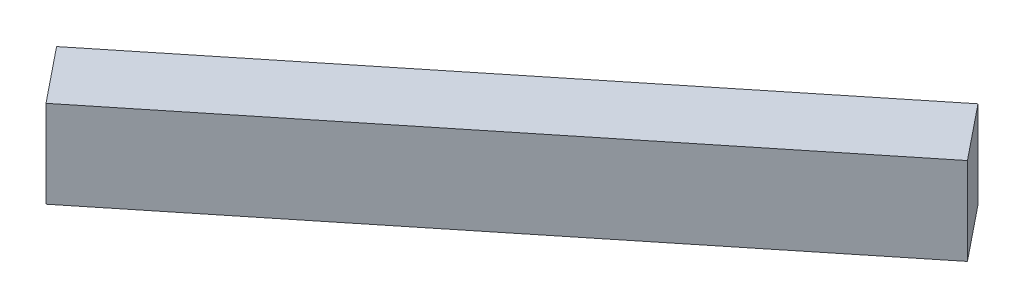
ISO-10303-21;
HEADER;
FILE_DESCRIPTION(('STEP AP214'),'2;1');
FILE_NAME('part.step','',(''),(''),'','','');
FILE_SCHEMA(('AUTOMOTIVE_DESIGN { 1 0 10303 214 1 1 1 1 }'));
ENDSEC;
DATA;
#1=APPLICATION_CONTEXT('core data for automotive mechanical design processes');
#2=APPLICATION_PROTOCOL_DEFINITION('international standard','automotive_design',2000,#1);
#3=PRODUCT_CONTEXT('',#1,'mechanical');
#4=PRODUCT('Part','Part','',(#3));
#5=PRODUCT_RELATED_PRODUCT_CATEGORY('part','',(#4));
#6=PRODUCT_DEFINITION_FORMATION('','',#4);
#7=PRODUCT_DEFINITION_CONTEXT('part definition',#1,'design');
#8=PRODUCT_DEFINITION('design','',#6,#7);
#9=PRODUCT_DEFINITION_SHAPE('','',#8);
#10=(LENGTH_UNIT() NAMED_UNIT(*) SI_UNIT(.MILLI.,.METRE.));
#11=(NAMED_UNIT(*) PLANE_ANGLE_UNIT() SI_UNIT($,.RADIAN.));
#12=(NAMED_UNIT(*) SI_UNIT($,.STERADIAN.) SOLID_ANGLE_UNIT());
#13=UNCERTAINTY_MEASURE_WITH_UNIT(LENGTH_MEASURE(1.E-05),#10,'distance_accuracy_value','');
#14=(GEOMETRIC_REPRESENTATION_CONTEXT(3) GLOBAL_UNCERTAINTY_ASSIGNED_CONTEXT((#13)) GLOBAL_UNIT_ASSIGNED_CONTEXT((#10,
#11,#12)) REPRESENTATION_CONTEXT('',''));
#15=CARTESIAN_POINT('',(0.,0.,0.));
#16=DIRECTION('',(0.,0.,1.));
#17=DIRECTION('',(1.,0.,0.));
#18=AXIS2_PLACEMENT_3D('',#15,#16,#17);
#19=CARTESIAN_POINT('',(13.9519511098659,7.874,-11.3695960101614));
#20=DIRECTION('',(0.627392406961112,0.,0.778703260355023));
#21=DIRECTION('',(0.778703260355023,0.,-0.627392406961112));
#22=AXIS2_PLACEMENT_3D('',#19,#20,#21);
#23=PLANE('',#22);
#24=DIRECTION('',(0.,1.,0.));
#25=VECTOR('',#24,1.);
#26=CARTESIAN_POINT('',(13.9519511098659,7.874,-11.3695960101614));
#27=LINE('',#26,#25);
#28=CARTESIAN_POINT('',(13.9519511098659,7.62,-11.3695960101614));
#29=VERTEX_POINT('',#28);
#30=CARTESIAN_POINT('',(13.9519511098659,7.874,-11.3695960101614));
#31=VERTEX_POINT('',#30);
#32=EDGE_CURVE('E20',#29,#31,#27,.T.);
#33=ORIENTED_EDGE('',*,*,#32,.T.);
#34=DIRECTION('',(0.778703260355018,0.,-0.627392406961118));
#35=VECTOR('',#34,1.);
#36=CARTESIAN_POINT('',(13.9519511098659,7.874,-11.3695960101614));
#37=LINE('',#36,#35);
#38=CARTESIAN_POINT('',(15.4353808208423,7.874,-12.5647785454224));
#39=VERTEX_POINT('',#38);
#40=EDGE_CURVE('E55',#31,#39,#37,.T.);
#41=ORIENTED_EDGE('',*,*,#40,.T.);
#42=DIRECTION('',(0.,1.,0.));
#43=VECTOR('',#42,1.);
#44=CARTESIAN_POINT('',(15.4353808208423,7.874,-12.5647785454224));
#45=LINE('',#44,#43);
#46=CARTESIAN_POINT('',(15.4353808208423,7.62,-12.5647785454224));
#47=VERTEX_POINT('',#46);
#48=EDGE_CURVE('E76',#39,#47,#45,.F.);
#49=ORIENTED_EDGE('',*,*,#48,.T.);
#50=DIRECTION('',(0.778703260355018,0.,-0.627392406961118));
#51=VECTOR('',#50,1.);
#52=CARTESIAN_POINT('',(13.9519511098659,7.62,-11.3695960101614));
#53=LINE('',#52,#51);
#54=EDGE_CURVE('E58',#29,#47,#53,.T.);
#55=ORIENTED_EDGE('',*,*,#54,.F.);
#56=EDGE_LOOP('',(#33,#41,#49,#55));
#57=FACE_BOUND('',#56,.T.);
#58=ADVANCED_FACE('F17',(#57),#23,.F.);
#59=CARTESIAN_POINT('',(13.9519511098659,7.874,-11.3695960101614));
#60=DIRECTION('',(0.778703260355001,0.,-0.627392406961139));
#61=DIRECTION('',(-0.627392406961139,0.,-0.778703260355001));
#62=AXIS2_PLACEMENT_3D('',#59,#60,#61);
#63=PLANE('',#62);
#64=DIRECTION('',(0.,1.,0.));
#65=VECTOR('',#64,1.);
#66=CARTESIAN_POINT('',(14.0794372469605,7.874,-11.2113635076573));
#67=LINE('',#66,#65);
#68=CARTESIAN_POINT('',(14.0794372469605,7.62,-11.2113635076573));
#69=VERTEX_POINT('',#68);
#70=CARTESIAN_POINT('',(14.0794372469605,7.874,-11.2113635076573));
#71=VERTEX_POINT('',#70);
#72=EDGE_CURVE('E73',#69,#71,#67,.T.);
#73=ORIENTED_EDGE('',*,*,#72,.T.);
#74=DIRECTION('',(-0.627392406961511,0.,-0.778703260354701));
#75=VECTOR('',#74,1.);
#76=CARTESIAN_POINT('',(14.0794372469605,7.874,-11.2113635076573));
#77=LINE('',#76,#75);
#78=EDGE_CURVE('E63',#71,#31,#77,.T.);
#79=ORIENTED_EDGE('',*,*,#78,.T.);
#80=ORIENTED_EDGE('',*,*,#32,.F.);
#81=DIRECTION('',(-0.627392406961511,0.,-0.778703260354701));
#82=VECTOR('',#81,1.);
#83=CARTESIAN_POINT('',(14.0794372469605,7.62,-11.2113635076573));
#84=LINE('',#83,#82);
#85=EDGE_CURVE('E80',#69,#29,#84,.T.);
#86=ORIENTED_EDGE('',*,*,#85,.F.);
#87=EDGE_LOOP('',(#73,#79,#80,#86));
#88=FACE_BOUND('',#87,.T.);
#89=ADVANCED_FACE('F72',(#88),#63,.F.);
#90=CARTESIAN_POINT('',(13.9519511098659,7.874,-11.3695960101614));
#91=DIRECTION('',(0.,-1.,0.));
#92=DIRECTION('',(0.,0.,-1.));
#93=AXIS2_PLACEMENT_3D('',#90,#91,#92);
#94=PLANE('',#93);
#95=ORIENTED_EDGE('',*,*,#78,.F.);
#96=DIRECTION('',(-0.778703260355024,0.,0.62739240696111));
#97=VECTOR('',#96,1.);
#98=CARTESIAN_POINT('',(14.0794372469605,7.874,-11.2113635076573));
#99=LINE('',#98,#97);
#100=CARTESIAN_POINT('',(15.5628669581776,7.874,-12.4065460431123));
#101=VERTEX_POINT('',#100);
#102=EDGE_CURVE('E83',#71,#101,#99,.F.);
#103=ORIENTED_EDGE('',*,*,#102,.T.);
#104=DIRECTION('',(0.627392408146502,0.,0.778703259399968));
#105=VECTOR('',#104,1.);
#106=CARTESIAN_POINT('',(15.4353808208423,7.874,-12.5647785454224));
#107=LINE('',#106,#105);
#108=EDGE_CURVE('E69',#101,#39,#107,.F.);
#109=ORIENTED_EDGE('',*,*,#108,.T.);
#110=ORIENTED_EDGE('',*,*,#40,.F.);
#111=EDGE_LOOP('',(#95,#103,#109,#110));
#112=FACE_BOUND('',#111,.T.);
#113=ADVANCED_FACE('F66',(#112),#94,.F.);
#114=CARTESIAN_POINT('',(15.4353808208423,7.874,-12.5647785454224));
#115=DIRECTION('',(-0.778703259399968,0.,0.627392408146502));
#116=DIRECTION('',(0.627392408146502,0.,0.778703259399968));
#117=AXIS2_PLACEMENT_3D('',#114,#115,#116);
#118=PLANE('',#117);
#119=ORIENTED_EDGE('',*,*,#48,.F.);
#120=ORIENTED_EDGE('',*,*,#108,.F.);
#121=DIRECTION('',(0.,1.,0.));
#122=VECTOR('',#121,1.);
#123=CARTESIAN_POINT('',(15.5628669581776,7.874,-12.4065460431122));
#124=LINE('',#123,#122);
#125=CARTESIAN_POINT('',(15.5628669581776,7.62,-12.4065460431123));
#126=VERTEX_POINT('',#125);
#127=EDGE_CURVE('E26',#101,#126,#124,.F.);
#128=ORIENTED_EDGE('',*,*,#127,.T.);
#129=DIRECTION('',(0.627392408146235,0.,0.778703259400182));
#130=VECTOR('',#129,1.);
#131=CARTESIAN_POINT('',(15.4353808208423,7.62,-12.5647785454224));
#132=LINE('',#131,#130);
#133=EDGE_CURVE('E34',#47,#126,#132,.T.);
#134=ORIENTED_EDGE('',*,*,#133,.F.);
#135=EDGE_LOOP('',(#119,#120,#128,#134));
#136=FACE_BOUND('',#135,.T.);
#137=ADVANCED_FACE('F88',(#136),#118,.F.);
#138=CARTESIAN_POINT('',(13.9519511098659,7.62,-11.3695960101614));
#139=DIRECTION('',(0.,-1.,0.));
#140=DIRECTION('',(0.,0.,-1.));
#141=AXIS2_PLACEMENT_3D('',#138,#139,#140);
#142=PLANE('',#141);
#143=DIRECTION('',(-0.778703260355024,0.,0.62739240696111));
#144=VECTOR('',#143,1.);
#145=CARTESIAN_POINT('',(14.0794372469605,7.62,-11.2113635076573));
#146=LINE('',#145,#144);
#147=EDGE_CURVE('E11',#126,#69,#146,.T.);
#148=ORIENTED_EDGE('',*,*,#147,.T.);
#149=ORIENTED_EDGE('',*,*,#85,.T.);
#150=ORIENTED_EDGE('',*,*,#54,.T.);
#151=ORIENTED_EDGE('',*,*,#133,.T.);
#152=EDGE_LOOP('',(#148,#149,#150,#151));
#153=FACE_BOUND('',#152,.T.);
#154=ADVANCED_FACE('F91',(#153),#142,.T.);
#155=CARTESIAN_POINT('',(14.0794372469605,7.874,-11.2113635076573));
#156=DIRECTION('',(-0.62739240696111,0.,-0.778703260355024));
#157=DIRECTION('',(-0.778703260355024,0.,0.62739240696111));
#158=AXIS2_PLACEMENT_3D('',#155,#156,#157);
#159=PLANE('',#158);
#160=ORIENTED_EDGE('',*,*,#127,.F.);
#161=ORIENTED_EDGE('',*,*,#102,.F.);
#162=ORIENTED_EDGE('',*,*,#72,.F.);
#163=ORIENTED_EDGE('',*,*,#147,.F.);
#164=EDGE_LOOP('',(#160,#161,#162,#163));
#165=FACE_BOUND('',#164,.T.);
#166=ADVANCED_FACE('F90',(#165),#159,.F.);
#167=CLOSED_SHELL('',(#58,#89,#113,#137,#154,#166));
#168=MANIFOLD_SOLID_BREP('B1',#167);
#169=ADVANCED_BREP_SHAPE_REPRESENTATION('',(#18,#168),#14);
#170=SHAPE_DEFINITION_REPRESENTATION(#9,#169);
ENDSEC;
END-ISO-10303-21;
